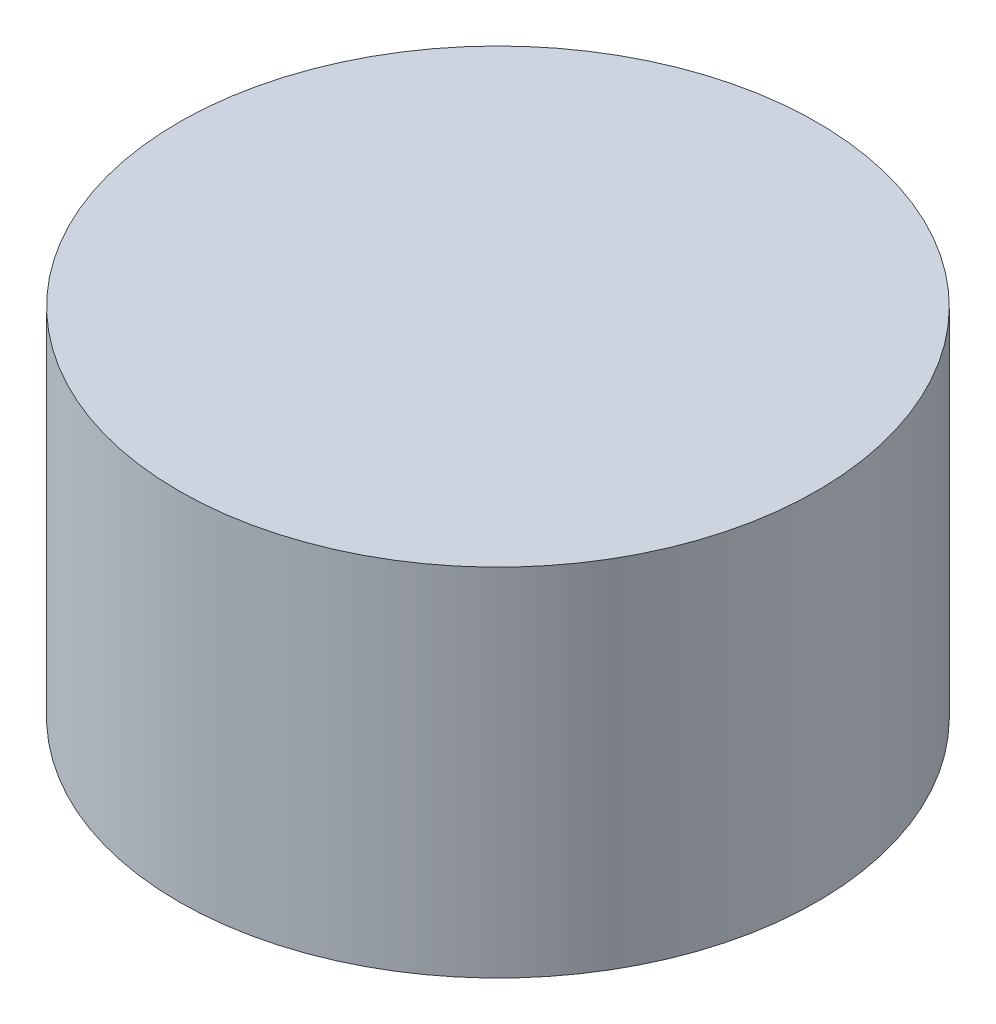
ISO-10303-21;
HEADER;
FILE_DESCRIPTION(('STEP AP214'),'2;1');
FILE_NAME('part.step','',(''),(''),'','','');
FILE_SCHEMA(('AUTOMOTIVE_DESIGN { 1 0 10303 214 1 1 1 1 }'));
ENDSEC;
DATA;
#1=APPLICATION_CONTEXT('core data for automotive mechanical design processes');
#2=APPLICATION_PROTOCOL_DEFINITION('international standard','automotive_design',2000,#1);
#3=PRODUCT_CONTEXT('',#1,'mechanical');
#4=PRODUCT('Part','Part','',(#3));
#5=PRODUCT_RELATED_PRODUCT_CATEGORY('part','',(#4));
#6=PRODUCT_DEFINITION_FORMATION('','',#4);
#7=PRODUCT_DEFINITION_CONTEXT('part definition',#1,'design');
#8=PRODUCT_DEFINITION('design','',#6,#7);
#9=PRODUCT_DEFINITION_SHAPE('','',#8);
#10=(LENGTH_UNIT() NAMED_UNIT(*) SI_UNIT(.MILLI.,.METRE.));
#11=(NAMED_UNIT(*) PLANE_ANGLE_UNIT() SI_UNIT($,.RADIAN.));
#12=(NAMED_UNIT(*) SI_UNIT($,.STERADIAN.) SOLID_ANGLE_UNIT());
#13=UNCERTAINTY_MEASURE_WITH_UNIT(LENGTH_MEASURE(1.E-05),#10,'distance_accuracy_value','');
#14=(GEOMETRIC_REPRESENTATION_CONTEXT(3) GLOBAL_UNCERTAINTY_ASSIGNED_CONTEXT((#13)) GLOBAL_UNIT_ASSIGNED_CONTEXT((#10,
#11,#12)) REPRESENTATION_CONTEXT('',''));
#15=CARTESIAN_POINT('',(0.,0.,0.));
#16=DIRECTION('',(0.,0.,1.));
#17=DIRECTION('',(1.,0.,0.));
#18=AXIS2_PLACEMENT_3D('',#15,#16,#17);
#19=CARTESIAN_POINT('',(0.,16.1672415112744,0.));
#20=DIRECTION('',(0.,-1.,0.));
#21=DIRECTION('',(0.,0.,-1.));
#22=AXIS2_PLACEMENT_3D('',#19,#20,#21);
#23=CYLINDRICAL_SURFACE('',#22,14.5);
#24=CARTESIAN_POINT('',(0.,16.1672415112744,0.));
#25=DIRECTION('',(0.,1.,0.));
#26=DIRECTION('',(0.,0.,1.));
#27=AXIS2_PLACEMENT_3D('',#24,#25,#26);
#28=CIRCLE('',#27,14.5);
#29=CARTESIAN_POINT('',(0.,16.1672415112744,14.5));
#30=VERTEX_POINT('',#29);
#31=EDGE_CURVE('E10',#30,#30,#28,.T.);
#32=ORIENTED_EDGE('',*,*,#31,.F.);
#33=EDGE_LOOP('',(#32));
#34=FACE_BOUND('',#33,.T.);
#35=CARTESIAN_POINT('',(0.,0.,0.));
#36=DIRECTION('',(0.,1.,0.));
#37=DIRECTION('',(0.,0.,1.));
#38=AXIS2_PLACEMENT_3D('',#35,#36,#37);
#39=CIRCLE('',#38,14.5);
#40=CARTESIAN_POINT('',(0.,0.,14.5));
#41=VERTEX_POINT('',#40);
#42=EDGE_CURVE('E34',#41,#41,#39,.T.);
#43=ORIENTED_EDGE('',*,*,#42,.T.);
#44=EDGE_LOOP('',(#43));
#45=FACE_BOUND('',#44,.T.);
#46=ADVANCED_FACE('F31',(#34,#45),#23,.T.);
#47=CARTESIAN_POINT('',(0.,16.1672415112744,0.));
#48=DIRECTION('',(0.,1.,0.));
#49=DIRECTION('',(0.,0.,1.));
#50=AXIS2_PLACEMENT_3D('',#47,#48,#49);
#51=PLANE('',#50);
#52=ORIENTED_EDGE('',*,*,#31,.T.);
#53=EDGE_LOOP('',(#52));
#54=FACE_BOUND('',#53,.T.);
#55=ADVANCED_FACE('F46',(#54),#51,.T.);
#56=CARTESIAN_POINT('',(0.,0.,0.));
#57=DIRECTION('',(0.,1.,0.));
#58=DIRECTION('',(0.,0.,1.));
#59=AXIS2_PLACEMENT_3D('',#56,#57,#58);
#60=PLANE('',#59);
#61=ORIENTED_EDGE('',*,*,#42,.F.);
#62=EDGE_LOOP('',(#61));
#63=FACE_BOUND('',#62,.T.);
#64=ADVANCED_FACE('F44',(#63),#60,.F.);
#65=CLOSED_SHELL('',(#46,#55,#64));
#66=MANIFOLD_SOLID_BREP('B2',#65);
#67=ADVANCED_BREP_SHAPE_REPRESENTATION('',(#18,#66),#14);
#68=SHAPE_DEFINITION_REPRESENTATION(#9,#67);
ENDSEC;
END-ISO-10303-21;
